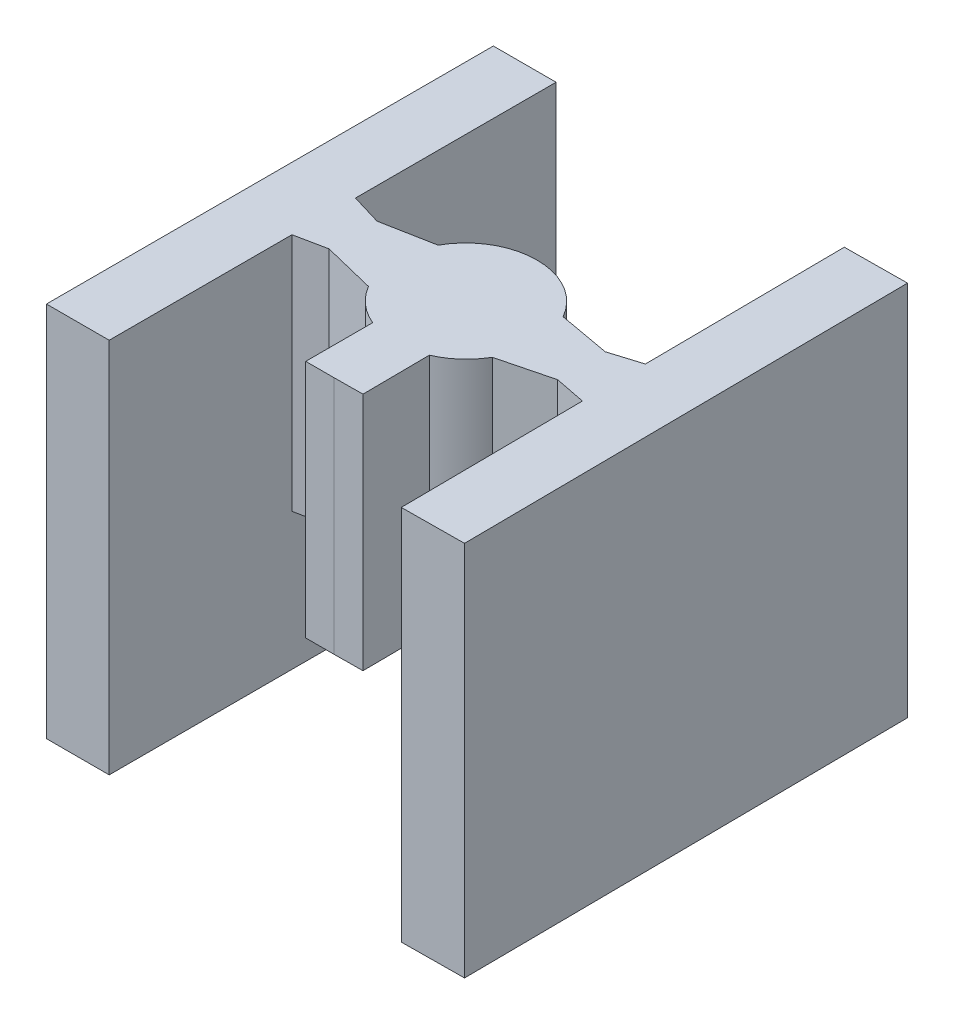
ISO-10303-21;
HEADER;
FILE_DESCRIPTION(('STEP AP214'),'2;1');
FILE_NAME('part.step','',(''),(''),'','','');
FILE_SCHEMA(('AUTOMOTIVE_DESIGN { 1 0 10303 214 1 1 1 1 }'));
ENDSEC;
DATA;
#1=APPLICATION_CONTEXT('core data for automotive mechanical design processes');
#2=APPLICATION_PROTOCOL_DEFINITION('international standard','automotive_design',2000,#1);
#3=PRODUCT_CONTEXT('',#1,'mechanical');
#4=PRODUCT('Part','Part','',(#3));
#5=PRODUCT_RELATED_PRODUCT_CATEGORY('part','',(#4));
#6=PRODUCT_DEFINITION_FORMATION('','',#4);
#7=PRODUCT_DEFINITION_CONTEXT('part definition',#1,'design');
#8=PRODUCT_DEFINITION('design','',#6,#7);
#9=PRODUCT_DEFINITION_SHAPE('','',#8);
#10=(LENGTH_UNIT() NAMED_UNIT(*) SI_UNIT(.MILLI.,.METRE.));
#11=(NAMED_UNIT(*) PLANE_ANGLE_UNIT() SI_UNIT($,.RADIAN.));
#12=(NAMED_UNIT(*) SI_UNIT($,.STERADIAN.) SOLID_ANGLE_UNIT());
#13=UNCERTAINTY_MEASURE_WITH_UNIT(LENGTH_MEASURE(1.E-05),#10,'distance_accuracy_value','');
#14=(GEOMETRIC_REPRESENTATION_CONTEXT(3) GLOBAL_UNCERTAINTY_ASSIGNED_CONTEXT((#13)) GLOBAL_UNIT_ASSIGNED_CONTEXT((#10,
#11,#12)) REPRESENTATION_CONTEXT('',''));
#15=CARTESIAN_POINT('',(0.,0.,0.));
#16=DIRECTION('',(0.,0.,1.));
#17=DIRECTION('',(1.,0.,0.));
#18=AXIS2_PLACEMENT_3D('',#15,#16,#17);
#19=CARTESIAN_POINT('',(30.4201519427729,0.,-37.7047103668261));
#20=DIRECTION('',(0.,1.,0.));
#21=DIRECTION('',(0.,0.,1.));
#22=AXIS2_PLACEMENT_3D('',#19,#20,#21);
#23=PLANE('',#22);
#24=DIRECTION('',(0.999962808426345,0.,-0.00862448630909776));
#25=VECTOR('',#24,1.);
#26=CARTESIAN_POINT('',(43.2743821323213,0.,-19.203600276804));
#27=LINE('',#26,#25);
#28=CARTESIAN_POINT('',(43.2743821323213,0.,-19.203600276804));
#29=VERTEX_POINT('',#28);
#30=CARTESIAN_POINT('',(48.7741775786662,0.,-19.251034951504));
#31=VERTEX_POINT('',#30);
#32=EDGE_CURVE('E309',#29,#31,#27,.T.);
#33=ORIENTED_EDGE('',*,*,#32,.F.);
#34=DIRECTION('',(0.00862448630909662,0.,0.999962808426346));
#35=VECTOR('',#34,1.);
#36=CARTESIAN_POINT('',(42.9365132233006,0.,-58.3776833509426));
#37=LINE('',#36,#35);
#38=CARTESIAN_POINT('',(42.9365132233006,0.,-58.3776833509426));
#39=VERTEX_POINT('',#38);
#40=EDGE_CURVE('E303',#39,#29,#37,.T.);
#41=ORIENTED_EDGE('',*,*,#40,.F.);
#42=DIRECTION('',(-0.999962808426346,0.,0.00862448630909529));
#43=VECTOR('',#42,1.);
#44=CARTESIAN_POINT('',(48.4363086696455,0.,-58.4251180256426));
#45=LINE('',#44,#43);
#46=CARTESIAN_POINT('',(48.4363086696455,0.,-58.4251180256426));
#47=VERTEX_POINT('',#46);
#48=EDGE_CURVE('E305',#47,#39,#45,.T.);
#49=ORIENTED_EDGE('',*,*,#48,.F.);
#50=DIRECTION('',(-0.008624486309097,0.,-0.999962808426346));
#51=VECTOR('',#50,1.);
#52=CARTESIAN_POINT('',(48.7741775786662,0.,-19.251034951504));
#53=LINE('',#52,#51);
#54=EDGE_CURVE('E307',#31,#47,#53,.T.);
#55=ORIENTED_EDGE('',*,*,#54,.F.);
#56=EDGE_LOOP('',(#33,#41,#49,#55));
#57=FACE_BOUND('',#56,.T.);
#58=ADVANCED_FACE('F33',(#57),#23,.F.);
#59=DIRECTION('',(-1.,0.,0.));
#60=VECTOR('',#59,1.);
#61=CARTESIAN_POINT('',(12.2796476849857,0.,-58.2691988123798));
#62=LINE('',#61,#60);
#63=CARTESIAN_POINT('',(17.7796476849856,0.,-58.2691988123798));
#64=VERTEX_POINT('',#63);
#65=CARTESIAN_POINT('',(12.2796476849857,0.,-58.2691988123798));
#66=VERTEX_POINT('',#65);
#67=EDGE_CURVE('E301',#64,#66,#62,.T.);
#68=ORIENTED_EDGE('',*,*,#67,.F.);
#69=DIRECTION('',(0.,0.,-1.));
#70=VECTOR('',#69,1.);
#71=CARTESIAN_POINT('',(17.7796476849856,0.,-35.1144431425172));
#72=LINE('',#71,#70);
#73=CARTESIAN_POINT('',(17.7796476849856,0.,-19.093658738257));
#74=VERTEX_POINT('',#73);
#75=EDGE_CURVE('E294',#74,#64,#72,.T.);
#76=ORIENTED_EDGE('',*,*,#75,.F.);
#77=DIRECTION('',(1.,0.,0.));
#78=VECTOR('',#77,1.);
#79=CARTESIAN_POINT('',(17.7796476849856,0.,-19.093658738257));
#80=LINE('',#79,#78);
#81=CARTESIAN_POINT('',(12.2796476849856,0.,-19.093658738257));
#82=VERTEX_POINT('',#81);
#83=EDGE_CURVE('E297',#82,#74,#80,.T.);
#84=ORIENTED_EDGE('',*,*,#83,.F.);
#85=DIRECTION('',(0.,0.,1.));
#86=VECTOR('',#85,1.);
#87=CARTESIAN_POINT('',(12.2796476849856,0.,-19.093658738257));
#88=LINE('',#87,#86);
#89=EDGE_CURVE('E299',#66,#82,#88,.T.);
#90=ORIENTED_EDGE('',*,*,#89,.F.);
#91=EDGE_LOOP('',(#68,#76,#84,#90));
#92=FACE_BOUND('',#91,.T.);
#93=ADVANCED_FACE('F485',(#92),#23,.F.);
#94=CARTESIAN_POINT('',(27.9970189702549,33.,-26.1043973727644));
#95=DIRECTION('',(1.,0.,0.));
#96=DIRECTION('',(0.,0.,-1.));
#97=AXIS2_PLACEMENT_3D('',#94,#95,#96);
#98=PLANE('',#97);
#99=DIRECTION('',(0.,-1.,0.));
#100=VECTOR('',#99,1.);
#101=CARTESIAN_POINT('',(27.9970189702549,33.,-31.9709533691748));
#102=LINE('',#101,#100);
#103=CARTESIAN_POINT('',(27.9970189702549,33.,-31.9709533691748));
#104=VERTEX_POINT('',#103);
#105=CARTESIAN_POINT('',(27.9970189702549,12.,-31.9709533691748));
#106=VERTEX_POINT('',#105);
#107=EDGE_CURVE('E290',#104,#106,#102,.T.);
#108=ORIENTED_EDGE('',*,*,#107,.T.);
#109=DIRECTION('',(0.,0.,1.));
#110=VECTOR('',#109,1.);
#111=CARTESIAN_POINT('',(27.9970189702549,12.,-31.9709533691748));
#112=LINE('',#111,#110);
#113=CARTESIAN_POINT('',(27.9970189702549,12.,-26.1043973727644));
#114=VERTEX_POINT('',#113);
#115=EDGE_CURVE('E366',#106,#114,#112,.T.);
#116=ORIENTED_EDGE('',*,*,#115,.T.);
#117=DIRECTION('',(0.,-1.,0.));
#118=VECTOR('',#117,1.);
#119=CARTESIAN_POINT('',(27.9970189702549,33.,-26.1043973727644));
#120=LINE('',#119,#118);
#121=CARTESIAN_POINT('',(27.9970189702549,33.,-26.1043973727644));
#122=VERTEX_POINT('',#121);
#123=EDGE_CURVE('E11',#122,#114,#120,.T.);
#124=ORIENTED_EDGE('',*,*,#123,.F.);
#125=DIRECTION('',(0.,0.,1.));
#126=VECTOR('',#125,1.);
#127=CARTESIAN_POINT('',(27.9970189702549,33.,-26.1043973727644));
#128=LINE('',#127,#126);
#129=EDGE_CURVE('E296',#104,#122,#128,.T.);
#130=ORIENTED_EDGE('',*,*,#129,.F.);
#131=EDGE_LOOP('',(#108,#116,#124,#130));
#132=FACE_BOUND('',#131,.T.);
#133=ADVANCED_FACE('F35',(#132),#98,.F.);
#134=CARTESIAN_POINT('',(27.9970189702549,33.,-26.1043973727644));
#135=DIRECTION('',(0.,0.,-1.));
#136=DIRECTION('',(-1.,0.,0.));
#137=AXIS2_PLACEMENT_3D('',#134,#135,#136);
#138=PLANE('',#137);
#139=ORIENTED_EDGE('',*,*,#123,.T.);
#140=DIRECTION('',(-1.,0.,0.));
#141=VECTOR('',#140,1.);
#142=CARTESIAN_POINT('',(27.9970189702549,12.,-26.1043973727643));
#143=LINE('',#142,#141);
#144=CARTESIAN_POINT('',(30.4970193884969,12.,-26.1043973727643));
#145=VERTEX_POINT('',#144);
#146=EDGE_CURVE('E48',#145,#114,#143,.T.);
#147=ORIENTED_EDGE('',*,*,#146,.F.);
#148=DIRECTION('',(0.,-1.,0.));
#149=VECTOR('',#148,1.);
#150=CARTESIAN_POINT('',(30.4970193885017,33.,-26.1043973727644));
#151=LINE('',#150,#149);
#152=CARTESIAN_POINT('',(30.4970193885017,33.,-26.1043973727644));
#153=VERTEX_POINT('',#152);
#154=EDGE_CURVE('E41',#153,#145,#151,.T.);
#155=ORIENTED_EDGE('',*,*,#154,.F.);
#156=DIRECTION('',(1.,0.,0.));
#157=VECTOR('',#156,1.);
#158=CARTESIAN_POINT('',(27.9970189702549,33.,-26.1043973727644));
#159=LINE('',#158,#157);
#160=EDGE_CURVE('E358',#122,#153,#159,.T.);
#161=ORIENTED_EDGE('',*,*,#160,.F.);
#162=EDGE_LOOP('',(#139,#147,#155,#161));
#163=FACE_BOUND('',#162,.T.);
#164=ADVANCED_FACE('F218',(#163),#138,.F.);
#165=CARTESIAN_POINT('',(32.9969268277988,33.,-26.1259585921443));
#166=DIRECTION('',(-0.00862448630909563,0.,-0.999962808426345));
#167=DIRECTION('',(-0.999962808426346,0.,0.00862448630909563));
#168=AXIS2_PLACEMENT_3D('',#165,#166,#167);
#169=PLANE('',#168);
#170=ORIENTED_EDGE('',*,*,#154,.T.);
#171=DIRECTION('',(0.999962808426346,0.,-0.00862448630909563));
#172=VECTOR('',#171,1.);
#173=CARTESIAN_POINT('',(32.9969268277988,12.,-26.1259585921443));
#174=LINE('',#173,#172);
#175=CARTESIAN_POINT('',(32.9969268277988,12.,-26.1259585921443));
#176=VERTEX_POINT('',#175);
#177=EDGE_CURVE('E206',#145,#176,#174,.T.);
#178=ORIENTED_EDGE('',*,*,#177,.T.);
#179=DIRECTION('',(0.,-1.,0.));
#180=VECTOR('',#179,1.);
#181=CARTESIAN_POINT('',(32.9969268277988,33.,-26.1259585921443));
#182=LINE('',#181,#180);
#183=CARTESIAN_POINT('',(32.9969268277988,33.,-26.1259585921443));
#184=VERTEX_POINT('',#183);
#185=EDGE_CURVE('E224',#184,#176,#182,.T.);
#186=ORIENTED_EDGE('',*,*,#185,.F.);
#187=DIRECTION('',(0.999962808426345,0.,-0.00862448630909563));
#188=VECTOR('',#187,1.);
#189=CARTESIAN_POINT('',(32.9969268277988,33.,-26.1259585921443));
#190=LINE('',#189,#188);
#191=EDGE_CURVE('E223',#153,#184,#190,.T.);
#192=ORIENTED_EDGE('',*,*,#191,.F.);
#193=EDGE_LOOP('',(#170,#178,#186,#192));
#194=FACE_BOUND('',#193,.T.);
#195=ADVANCED_FACE('F222',(#194),#169,.F.);
#196=CARTESIAN_POINT('',(32.9969268277988,33.,-26.1259585921443));
#197=DIRECTION('',(-0.999962808426345,0.,0.00862448630909741));
#198=DIRECTION('',(0.00862448630909741,0.,0.999962808426346));
#199=AXIS2_PLACEMENT_3D('',#196,#197,#198);
#200=PLANE('',#199);
#201=ORIENTED_EDGE('',*,*,#185,.T.);
#202=DIRECTION('',(-0.00862448630909741,0.,-0.999962808426346));
#203=VECTOR('',#202,1.);
#204=CARTESIAN_POINT('',(32.9969268277988,12.,-26.1259585921443));
#205=LINE('',#204,#203);
#206=CARTESIAN_POINT('',(32.9463307959262,12.,-31.9922964021052));
#207=VERTEX_POINT('',#206);
#208=EDGE_CURVE('E56',#176,#207,#205,.T.);
#209=ORIENTED_EDGE('',*,*,#208,.T.);
#210=DIRECTION('',(0.,-1.,0.));
#211=VECTOR('',#210,1.);
#212=CARTESIAN_POINT('',(32.9463307959262,33.,-31.9922964021052));
#213=LINE('',#212,#211);
#214=CARTESIAN_POINT('',(32.9463307959262,33.,-31.9922964021052));
#215=VERTEX_POINT('',#214);
#216=EDGE_CURVE('E225',#215,#207,#213,.T.);
#217=ORIENTED_EDGE('',*,*,#216,.F.);
#218=DIRECTION('',(-0.00862448630909741,0.,-0.999962808426346));
#219=VECTOR('',#218,1.);
#220=CARTESIAN_POINT('',(32.9969268277988,33.,-26.1259585921443));
#221=LINE('',#220,#219);
#222=EDGE_CURVE('E355',#184,#215,#221,.T.);
#223=ORIENTED_EDGE('',*,*,#222,.F.);
#224=EDGE_LOOP('',(#201,#209,#217,#223));
#225=FACE_BOUND('',#224,.T.);
#226=ADVANCED_FACE('F446',(#225),#200,.F.);
#227=CARTESIAN_POINT('',(30.4738372348107,33.,-37.7049418751643));
#228=DIRECTION('',(0.,-1.,0.));
#229=DIRECTION('',(0.,0.,-1.));
#230=AXIS2_PLACEMENT_3D('',#227,#228,#229);
#231=CYLINDRICAL_SURFACE('',#230,6.22475242163252);
#232=ORIENTED_EDGE('',*,*,#216,.T.);
#233=CARTESIAN_POINT('',(30.4738372348107,12.,-37.7049418751644));
#234=DIRECTION('',(0.,1.,0.));
#235=DIRECTION('',(0.,0.,1.));
#236=AXIS2_PLACEMENT_3D('',#233,#234,#235);
#237=CIRCLE('',#236,6.22475242163263);
#238=CARTESIAN_POINT('',(35.8638647298149,12.,-34.5912388845566));
#239=VERTEX_POINT('',#238);
#240=EDGE_CURVE('E369',#207,#239,#237,.T.);
#241=ORIENTED_EDGE('',*,*,#240,.T.);
#242=DIRECTION('',(0.,-1.,0.));
#243=VECTOR('',#242,1.);
#244=CARTESIAN_POINT('',(35.8638647298149,33.,-34.5912388845566));
#245=LINE('',#244,#243);
#246=CARTESIAN_POINT('',(35.8638647298149,33.,-34.5912388845566));
#247=VERTEX_POINT('',#246);
#248=EDGE_CURVE('E229',#247,#239,#245,.T.);
#249=ORIENTED_EDGE('',*,*,#248,.F.);
#250=CARTESIAN_POINT('',(30.4738372348107,33.,-37.7049418751643));
#251=DIRECTION('',(0.,1.,0.));
#252=DIRECTION('',(0.,0.,-1.));
#253=AXIS2_PLACEMENT_3D('',#250,#251,#252);
#254=CIRCLE('',#253,6.22475242163252);
#255=EDGE_CURVE('E353',#215,#247,#254,.T.);
#256=ORIENTED_EDGE('',*,*,#255,.F.);
#257=EDGE_LOOP('',(#232,#241,#249,#256));
#258=FACE_BOUND('',#257,.T.);
#259=ADVANCED_FACE('F444',(#258),#231,.T.);
#260=CARTESIAN_POINT('',(35.8638647298149,33.,-34.5912388845566));
#261=DIRECTION('',(-0.246647604540995,0.,-0.969105236377448));
#262=DIRECTION('',(-0.969105236377448,0.,0.246647604540995));
#263=AXIS2_PLACEMENT_3D('',#260,#261,#262);
#264=PLANE('',#263);
#265=ORIENTED_EDGE('',*,*,#248,.T.);
#266=DIRECTION('',(0.969105236377448,0.,-0.246647604540994));
#267=VECTOR('',#266,1.);
#268=CARTESIAN_POINT('',(35.8638647298149,12.,-34.5912388845566));
#269=LINE('',#268,#267);
#270=CARTESIAN_POINT('',(40.4315397694171,12.,-35.7537608321739));
#271=VERTEX_POINT('',#270);
#272=EDGE_CURVE('E371',#239,#271,#269,.T.);
#273=ORIENTED_EDGE('',*,*,#272,.T.);
#274=DIRECTION('',(0.,-1.,0.));
#275=VECTOR('',#274,1.);
#276=CARTESIAN_POINT('',(40.4315397694171,33.,-35.7537608321739));
#277=LINE('',#276,#275);
#278=CARTESIAN_POINT('',(40.4315397694171,33.,-35.7537608321739));
#279=VERTEX_POINT('',#278);
#280=EDGE_CURVE('E232',#279,#271,#277,.T.);
#281=ORIENTED_EDGE('',*,*,#280,.F.);
#282=DIRECTION('',(0.969105236377448,0.,-0.246647604540995));
#283=VECTOR('',#282,1.);
#284=CARTESIAN_POINT('',(35.8638647298149,33.,-34.5912388845566));
#285=LINE('',#284,#283);
#286=EDGE_CURVE('E351',#247,#279,#285,.T.);
#287=ORIENTED_EDGE('',*,*,#286,.F.);
#288=EDGE_LOOP('',(#265,#273,#281,#287));
#289=FACE_BOUND('',#288,.T.);
#290=ADVANCED_FACE('F439',(#289),#264,.F.);
#291=CARTESIAN_POINT('',(40.4315397694171,33.,-35.7537608321739));
#292=DIRECTION('',(0.192290170789592,0.,-0.981338112078457));
#293=DIRECTION('',(-0.981338112078457,0.,-0.192290170789592));
#294=AXIS2_PLACEMENT_3D('',#291,#292,#293);
#295=PLANE('',#294);
#296=ORIENTED_EDGE('',*,*,#280,.T.);
#297=DIRECTION('',(0.981338112078457,0.,0.192290170789592));
#298=VECTOR('',#297,1.);
#299=CARTESIAN_POINT('',(40.4315397694171,12.,-35.7537608321739));
#300=LINE('',#299,#298);
#301=CARTESIAN_POINT('',(43.1362110965658,12.,-35.223788842881));
#302=VERTEX_POINT('',#301);
#303=EDGE_CURVE('E373',#271,#302,#300,.T.);
#304=ORIENTED_EDGE('',*,*,#303,.T.);
#305=DIRECTION('',(0.,-1.,0.));
#306=VECTOR('',#305,1.);
#307=CARTESIAN_POINT('',(43.1362110965658,33.,-35.223788842881));
#308=LINE('',#307,#306);
#309=CARTESIAN_POINT('',(43.1362110965658,33.,-35.223788842881));
#310=VERTEX_POINT('',#309);
#311=EDGE_CURVE('E235',#310,#302,#308,.T.);
#312=ORIENTED_EDGE('',*,*,#311,.F.);
#313=DIRECTION('',(0.981338112078457,0.,0.192290170789592));
#314=VECTOR('',#313,1.);
#315=CARTESIAN_POINT('',(40.4315397694171,33.,-35.7537608321739));
#316=LINE('',#315,#314);
#317=EDGE_CURVE('E349',#279,#310,#316,.T.);
#318=ORIENTED_EDGE('',*,*,#317,.F.);
#319=EDGE_LOOP('',(#296,#304,#312,#318));
#320=FACE_BOUND('',#319,.T.);
#321=ADVANCED_FACE('F435',(#320),#295,.F.);
#322=CARTESIAN_POINT('',(43.2743821323213,33.,-19.203600276804));
#323=DIRECTION('',(-0.00862448630909776,0.,-0.999962808426345));
#324=DIRECTION('',(-0.999962808426346,0.,0.00862448630909776));
#325=AXIS2_PLACEMENT_3D('',#322,#323,#324);
#326=PLANE('',#325);
#327=ORIENTED_EDGE('',*,*,#32,.T.);
#328=DIRECTION('',(0.,-1.,0.));
#329=VECTOR('',#328,1.);
#330=CARTESIAN_POINT('',(48.7741775786662,33.,-19.251034951504));
#331=LINE('',#330,#329);
#332=CARTESIAN_POINT('',(48.7741775786662,33.,-19.251034951504));
#333=VERTEX_POINT('',#332);
#334=EDGE_CURVE('E241',#333,#31,#331,.T.);
#335=ORIENTED_EDGE('',*,*,#334,.F.);
#336=DIRECTION('',(0.999962808426345,0.,-0.00862448630909776));
#337=VECTOR('',#336,1.);
#338=CARTESIAN_POINT('',(43.2743821323213,33.,-19.203600276804));
#339=LINE('',#338,#337);
#340=CARTESIAN_POINT('',(43.2743821323213,33.,-19.203600276804));
#341=VERTEX_POINT('',#340);
#342=EDGE_CURVE('E345',#341,#333,#339,.T.);
#343=ORIENTED_EDGE('',*,*,#342,.F.);
#344=DIRECTION('',(0.,-1.,0.));
#345=VECTOR('',#344,1.);
#346=CARTESIAN_POINT('',(43.2743821323213,33.,-19.203600276804));
#347=LINE('',#346,#345);
#348=EDGE_CURVE('E238',#341,#29,#347,.T.);
#349=ORIENTED_EDGE('',*,*,#348,.T.);
#350=EDGE_LOOP('',(#327,#335,#343,#349));
#351=FACE_BOUND('',#350,.T.);
#352=ADVANCED_FACE('F532',(#351),#326,.F.);
#353=CARTESIAN_POINT('',(48.7741775786662,33.,-19.251034951504));
#354=DIRECTION('',(-0.999962808426345,0.,0.008624486309097));
#355=DIRECTION('',(0.008624486309097,0.,0.999962808426346));
#356=AXIS2_PLACEMENT_3D('',#353,#354,#355);
#357=PLANE('',#356);
#358=ORIENTED_EDGE('',*,*,#54,.T.);
#359=DIRECTION('',(0.,-1.,0.));
#360=VECTOR('',#359,1.);
#361=CARTESIAN_POINT('',(48.4363086696455,33.,-58.4251180256426));
#362=LINE('',#361,#360);
#363=CARTESIAN_POINT('',(48.4363086696455,33.,-58.4251180256426));
#364=VERTEX_POINT('',#363);
#365=EDGE_CURVE('E244',#364,#47,#362,.T.);
#366=ORIENTED_EDGE('',*,*,#365,.F.);
#367=DIRECTION('',(-0.008624486309097,0.,-0.999962808426346));
#368=VECTOR('',#367,1.);
#369=CARTESIAN_POINT('',(48.7741775786662,33.,-19.251034951504));
#370=LINE('',#369,#368);
#371=EDGE_CURVE('E343',#333,#364,#370,.T.);
#372=ORIENTED_EDGE('',*,*,#371,.F.);
#373=ORIENTED_EDGE('',*,*,#334,.T.);
#374=EDGE_LOOP('',(#358,#366,#372,#373));
#375=FACE_BOUND('',#374,.T.);
#376=ADVANCED_FACE('F528',(#375),#357,.F.);
#377=CARTESIAN_POINT('',(48.4363086696455,33.,-58.4251180256426));
#378=DIRECTION('',(0.00862448630909529,0.,0.999962808426345));
#379=DIRECTION('',(0.999962808426346,0.,-0.00862448630909529));
#380=AXIS2_PLACEMENT_3D('',#377,#378,#379);
#381=PLANE('',#380);
#382=ORIENTED_EDGE('',*,*,#48,.T.);
#383=DIRECTION('',(0.,-1.,0.));
#384=VECTOR('',#383,1.);
#385=CARTESIAN_POINT('',(42.9365132233006,33.,-58.3776833509426));
#386=LINE('',#385,#384);
#387=CARTESIAN_POINT('',(42.9365132233006,33.,-58.3776833509426));
#388=VERTEX_POINT('',#387);
#389=EDGE_CURVE('E247',#388,#39,#386,.T.);
#390=ORIENTED_EDGE('',*,*,#389,.F.);
#391=DIRECTION('',(-0.999962808426346,0.,0.00862448630909529));
#392=VECTOR('',#391,1.);
#393=CARTESIAN_POINT('',(48.4363086696455,33.,-58.4251180256426));
#394=LINE('',#393,#392);
#395=EDGE_CURVE('E341',#364,#388,#394,.T.);
#396=ORIENTED_EDGE('',*,*,#395,.F.);
#397=ORIENTED_EDGE('',*,*,#365,.T.);
#398=EDGE_LOOP('',(#382,#390,#396,#397));
#399=FACE_BOUND('',#398,.T.);
#400=ADVANCED_FACE('F525',(#399),#381,.F.);
#401=CARTESIAN_POINT('',(42.9365132233006,33.,-58.3776833509426));
#402=DIRECTION('',(0.999962808426345,0.,-0.00862448630909662));
#403=DIRECTION('',(-0.00862448630909662,0.,-0.999962808426346));
#404=AXIS2_PLACEMENT_3D('',#401,#402,#403);
#405=PLANE('',#404);
#406=ORIENTED_EDGE('',*,*,#40,.T.);
#407=ORIENTED_EDGE('',*,*,#348,.F.);
#408=DIRECTION('',(0.00862448630909483,0.,0.999962808426345));
#409=VECTOR('',#408,1.);
#410=CARTESIAN_POINT('',(43.1362110965658,33.,-35.223788842881));
#411=LINE('',#410,#409);
#412=EDGE_CURVE('E347',#310,#341,#411,.T.);
#413=ORIENTED_EDGE('',*,*,#412,.F.);
#414=ORIENTED_EDGE('',*,*,#311,.T.);
#415=DIRECTION('',(-0.0086244863090982,0.,-0.999962808426346));
#416=VECTOR('',#415,1.);
#417=CARTESIAN_POINT('',(43.1362110965658,12.,-35.223788842881));
#418=LINE('',#417,#416);
#419=CARTESIAN_POINT('',(43.0881960389902,12.,-40.7908765625737));
#420=VERTEX_POINT('',#419);
#421=EDGE_CURVE('E375',#302,#420,#418,.T.);
#422=ORIENTED_EDGE('',*,*,#421,.T.);
#423=DIRECTION('',(0.,-1.,0.));
#424=VECTOR('',#423,1.);
#425=CARTESIAN_POINT('',(43.0881960389902,33.,-40.7908765625737));
#426=LINE('',#425,#424);
#427=CARTESIAN_POINT('',(43.0881960389902,33.,-40.7908765625737));
#428=VERTEX_POINT('',#427);
#429=EDGE_CURVE('E250',#428,#420,#426,.T.);
#430=ORIENTED_EDGE('',*,*,#429,.F.);
#431=DIRECTION('',(0.00862448630909662,0.,0.999962808426346));
#432=VECTOR('',#431,1.);
#433=CARTESIAN_POINT('',(42.9365132233006,33.,-58.3776833509426));
#434=LINE('',#433,#432);
#435=EDGE_CURVE('E339',#388,#428,#434,.T.);
#436=ORIENTED_EDGE('',*,*,#435,.F.);
#437=ORIENTED_EDGE('',*,*,#389,.T.);
#438=EDGE_LOOP('',(#406,#407,#413,#414,#422,#430,#436,#437));
#439=FACE_BOUND('',#438,.T.);
#440=ADVANCED_FACE('F428',(#439),#405,.F.);
#441=CARTESIAN_POINT('',(43.0881960389902,33.,-40.7908765625737));
#442=DIRECTION('',(0.295076846057064,0.,0.955473523924664));
#443=DIRECTION('',(0.955473523924664,0.,-0.295076846057064));
#444=AXIS2_PLACEMENT_3D('',#441,#442,#443);
#445=PLANE('',#444);
#446=ORIENTED_EDGE('',*,*,#429,.T.);
#447=DIRECTION('',(-0.955473523924664,0.,0.295076846057064));
#448=VECTOR('',#447,1.);
#449=CARTESIAN_POINT('',(43.0881960389902,12.,-40.7908765625737));
#450=LINE('',#449,#448);
#451=CARTESIAN_POINT('',(40.3952684480576,12.,-39.9592254908323));
#452=VERTEX_POINT('',#451);
#453=EDGE_CURVE('E378',#420,#452,#450,.T.);
#454=ORIENTED_EDGE('',*,*,#453,.T.);
#455=DIRECTION('',(0.,-1.,0.));
#456=VECTOR('',#455,1.);
#457=CARTESIAN_POINT('',(40.3952684480576,33.,-39.9592254908323));
#458=LINE('',#457,#456);
#459=CARTESIAN_POINT('',(40.3952684480576,33.,-39.9592254908323));
#460=VERTEX_POINT('',#459);
#461=EDGE_CURVE('E252',#460,#452,#458,.T.);
#462=ORIENTED_EDGE('',*,*,#461,.F.);
#463=DIRECTION('',(-0.955473523924664,0.,0.295076846057064));
#464=VECTOR('',#463,1.);
#465=CARTESIAN_POINT('',(43.0881960389902,33.,-40.7908765625737));
#466=LINE('',#465,#464);
#467=EDGE_CURVE('E337',#428,#460,#466,.T.);
#468=ORIENTED_EDGE('',*,*,#467,.F.);
#469=EDGE_LOOP('',(#446,#454,#462,#468));
#470=FACE_BOUND('',#469,.T.);
#471=ADVANCED_FACE('F520',(#470),#445,.F.);
#472=CARTESIAN_POINT('',(35.8886314142691,33.,-40.7753729043073));
#473=DIRECTION('',(-0.178200359676966,0.,0.983994223464244));
#474=DIRECTION('',(0.983994223464244,0.,0.178200359676966));
#475=AXIS2_PLACEMENT_3D('',#472,#473,#474);
#476=PLANE('',#475);
#477=ORIENTED_EDGE('',*,*,#461,.T.);
#478=DIRECTION('',(-0.983994223464244,0.,-0.178200359676966));
#479=VECTOR('',#478,1.);
#480=CARTESIAN_POINT('',(40.3952684480576,12.,-39.9592254908323));
#481=LINE('',#480,#479);
#482=CARTESIAN_POINT('',(35.8886314142691,12.,-40.7753729043073));
#483=VERTEX_POINT('',#482);
#484=EDGE_CURVE('E380',#452,#483,#481,.T.);
#485=ORIENTED_EDGE('',*,*,#484,.T.);
#486=DIRECTION('',(0.,-1.,0.));
#487=VECTOR('',#486,1.);
#488=CARTESIAN_POINT('',(35.8886314142691,33.,-40.7753729043073));
#489=LINE('',#488,#487);
#490=CARTESIAN_POINT('',(35.8886314142691,33.,-40.7753729043073));
#491=VERTEX_POINT('',#490);
#492=EDGE_CURVE('E255',#491,#483,#489,.T.);
#493=ORIENTED_EDGE('',*,*,#492,.F.);
#494=DIRECTION('',(-0.983994223464244,0.,-0.178200359676966));
#495=VECTOR('',#494,1.);
#496=CARTESIAN_POINT('',(35.8886314142691,33.,-40.7753729043073));
#497=LINE('',#496,#495);
#498=EDGE_CURVE('E335',#460,#491,#497,.T.);
#499=ORIENTED_EDGE('',*,*,#498,.F.);
#500=EDGE_LOOP('',(#477,#485,#493,#499));
#501=FACE_BOUND('',#500,.T.);
#502=ADVANCED_FACE('F422',(#501),#476,.F.);
#503=CARTESIAN_POINT('',(30.4738372348107,33.,-37.7049418751643));
#504=DIRECTION('',(0.,-1.,0.));
#505=DIRECTION('',(0.,0.,-1.));
#506=AXIS2_PLACEMENT_3D('',#503,#504,#505);
#507=CYLINDRICAL_SURFACE('',#506,6.22475242163252);
#508=ORIENTED_EDGE('',*,*,#492,.T.);
#509=CARTESIAN_POINT('',(30.4738372348107,12.,-37.7049418751643));
#510=DIRECTION('',(0.,1.,0.));
#511=DIRECTION('',(0.,0.,1.));
#512=AXIS2_PLACEMENT_3D('',#509,#510,#511);
#513=CIRCLE('',#512,6.22475242163252);
#514=CARTESIAN_POINT('',(30.4201519427729,12.,-43.9294627884587));
#515=VERTEX_POINT('',#514);
#516=EDGE_CURVE('E214',#483,#515,#513,.T.);
#517=ORIENTED_EDGE('',*,*,#516,.T.);
#518=DIRECTION('',(0.,-1.,0.));
#519=VECTOR('',#518,1.);
#520=CARTESIAN_POINT('',(30.4201519427729,33.,-43.9294627884587));
#521=LINE('',#520,#519);
#522=CARTESIAN_POINT('',(30.4201519427729,33.,-43.9294627884587));
#523=VERTEX_POINT('',#522);
#524=EDGE_CURVE('E258',#523,#515,#521,.T.);
#525=ORIENTED_EDGE('',*,*,#524,.F.);
#526=CARTESIAN_POINT('',(30.4738372348107,33.,-37.7049418751643));
#527=DIRECTION('',(0.,1.,0.));
#528=DIRECTION('',(0.,0.,-1.));
#529=AXIS2_PLACEMENT_3D('',#526,#527,#528);
#530=CIRCLE('',#529,6.22475242163252);
#531=EDGE_CURVE('E333',#491,#523,#530,.T.);
#532=ORIENTED_EDGE('',*,*,#531,.F.);
#533=EDGE_LOOP('',(#508,#517,#525,#532));
#534=FACE_BOUND('',#533,.T.);
#535=ADVANCED_FACE('F394',(#534),#507,.T.);
#536=CARTESIAN_POINT('',(30.4201519427729,33.,-37.7047103668261));
#537=DIRECTION('',(0.,-1.,0.));
#538=DIRECTION('',(0.,0.,-1.));
#539=AXIS2_PLACEMENT_3D('',#536,#537,#538);
#540=CYLINDRICAL_SURFACE('',#539,6.22475242163251);
#541=ORIENTED_EDGE('',*,*,#524,.T.);
#542=CARTESIAN_POINT('',(30.4201519427729,12.,-37.7047103668261));
#543=DIRECTION('',(0.,1.,0.));
#544=DIRECTION('',(0.,0.,1.));
#545=AXIS2_PLACEMENT_3D('',#542,#543,#544);
#546=CIRCLE('',#545,6.22475242163256);
#547=CARTESIAN_POINT('',(24.9790782576572,12.,-40.72832738354));
#548=VERTEX_POINT('',#547);
#549=EDGE_CURVE('E382',#515,#548,#546,.T.);
#550=ORIENTED_EDGE('',*,*,#549,.T.);
#551=DIRECTION('',(0.,-1.,0.));
#552=VECTOR('',#551,1.);
#553=CARTESIAN_POINT('',(24.9790782576572,33.,-40.72832738354));
#554=LINE('',#553,#552);
#555=CARTESIAN_POINT('',(24.9790782576572,33.,-40.72832738354));
#556=VERTEX_POINT('',#555);
#557=EDGE_CURVE('E261',#556,#548,#554,.T.);
#558=ORIENTED_EDGE('',*,*,#557,.F.);
#559=CARTESIAN_POINT('',(30.4201519427729,33.,-37.7047103668261));
#560=DIRECTION('',(0.,1.,0.));
#561=DIRECTION('',(0.,0.,1.));
#562=AXIS2_PLACEMENT_3D('',#559,#560,#561);
#563=CIRCLE('',#562,6.22475242163251);
#564=EDGE_CURVE('E331',#523,#556,#563,.T.);
#565=ORIENTED_EDGE('',*,*,#564,.F.);
#566=EDGE_LOOP('',(#541,#550,#558,#565));
#567=FACE_BOUND('',#566,.T.);
#568=ADVANCED_FACE('F401',(#567),#540,.T.);
#569=CARTESIAN_POINT('',(24.9790782576572,33.,-40.72832738354));
#570=DIRECTION('',(0.186680176833693,0.,0.98242074060829));
#571=DIRECTION('',(0.98242074060829,0.,-0.186680176833693));
#572=AXIS2_PLACEMENT_3D('',#569,#570,#571);
#573=PLANE('',#572);
#574=ORIENTED_EDGE('',*,*,#557,.T.);
#575=DIRECTION('',(-0.98242074060829,0.,0.186680176833693));
#576=VECTOR('',#575,1.);
#577=CARTESIAN_POINT('',(20.4796476849856,12.,-39.8733428944736));
#578=LINE('',#577,#576);
#579=CARTESIAN_POINT('',(20.4796476849856,12.,-39.8733428944736));
#580=VERTEX_POINT('',#579);
#581=EDGE_CURVE('E384',#548,#580,#578,.T.);
#582=ORIENTED_EDGE('',*,*,#581,.T.);
#583=DIRECTION('',(0.,-1.,0.));
#584=VECTOR('',#583,1.);
#585=CARTESIAN_POINT('',(20.4796476849856,33.,-39.8733428944736));
#586=LINE('',#585,#584);
#587=CARTESIAN_POINT('',(20.4796476849856,33.,-39.8733428944736));
#588=VERTEX_POINT('',#587);
#589=EDGE_CURVE('E264',#588,#580,#586,.T.);
#590=ORIENTED_EDGE('',*,*,#589,.F.);
#591=DIRECTION('',(-0.98242074060829,0.,0.186680176833693));
#592=VECTOR('',#591,1.);
#593=CARTESIAN_POINT('',(24.9790782576572,33.,-40.72832738354));
#594=LINE('',#593,#592);
#595=EDGE_CURVE('E329',#556,#588,#594,.T.);
#596=ORIENTED_EDGE('',*,*,#595,.F.);
#597=EDGE_LOOP('',(#574,#582,#590,#596));
#598=FACE_BOUND('',#597,.T.);
#599=ADVANCED_FACE('F408',(#598),#573,.F.);
#600=CARTESIAN_POINT('',(17.7796476849856,33.,-40.6817379186636));
#601=DIRECTION('',(-0.286825403359055,0.,0.957982874579664));
#602=DIRECTION('',(0.957982874579664,0.,0.286825403359055));
#603=AXIS2_PLACEMENT_3D('',#600,#601,#602);
#604=PLANE('',#603);
#605=ORIENTED_EDGE('',*,*,#589,.T.);
#606=DIRECTION('',(-0.957982874579664,0.,-0.286825403359055));
#607=VECTOR('',#606,1.);
#608=CARTESIAN_POINT('',(17.7796476849856,12.,-40.6817379186636));
#609=LINE('',#608,#607);
#610=CARTESIAN_POINT('',(17.7796476849856,12.,-40.6817379186636));
#611=VERTEX_POINT('',#610);
#612=EDGE_CURVE('E386',#580,#611,#609,.T.);
#613=ORIENTED_EDGE('',*,*,#612,.T.);
#614=DIRECTION('',(0.,-1.,0.));
#615=VECTOR('',#614,1.);
#616=CARTESIAN_POINT('',(17.7796476849856,33.,-40.6817379186636));
#617=LINE('',#616,#615);
#618=CARTESIAN_POINT('',(17.7796476849856,33.,-40.6817379186636));
#619=VERTEX_POINT('',#618);
#620=EDGE_CURVE('E267',#619,#611,#617,.T.);
#621=ORIENTED_EDGE('',*,*,#620,.F.);
#622=DIRECTION('',(-0.957982874579664,0.,-0.286825403359055));
#623=VECTOR('',#622,1.);
#624=CARTESIAN_POINT('',(17.7796476849856,33.,-40.6817379186636));
#625=LINE('',#624,#623);
#626=EDGE_CURVE('E327',#588,#619,#625,.T.);
#627=ORIENTED_EDGE('',*,*,#626,.F.);
#628=EDGE_LOOP('',(#605,#613,#621,#627));
#629=FACE_BOUND('',#628,.T.);
#630=ADVANCED_FACE('F412',(#629),#604,.F.);
#631=CARTESIAN_POINT('',(12.2796476849857,33.,-58.2691988123798));
#632=DIRECTION('',(0.,0.,1.));
#633=DIRECTION('',(1.,0.,0.));
#634=AXIS2_PLACEMENT_3D('',#631,#632,#633);
#635=PLANE('',#634);
#636=ORIENTED_EDGE('',*,*,#67,.T.);
#637=DIRECTION('',(0.,-1.,0.));
#638=VECTOR('',#637,1.);
#639=CARTESIAN_POINT('',(12.2796476849857,33.,-58.2691988123798));
#640=LINE('',#639,#638);
#641=CARTESIAN_POINT('',(12.2796476849857,33.,-58.2691988123798));
#642=VERTEX_POINT('',#641);
#643=EDGE_CURVE('E273',#642,#66,#640,.T.);
#644=ORIENTED_EDGE('',*,*,#643,.F.);
#645=DIRECTION('',(-1.,0.,0.));
#646=VECTOR('',#645,1.);
#647=CARTESIAN_POINT('',(12.2796476849857,33.,-58.2691988123798));
#648=LINE('',#647,#646);
#649=CARTESIAN_POINT('',(17.7796476849856,33.,-58.2691988123798));
#650=VERTEX_POINT('',#649);
#651=EDGE_CURVE('E323',#650,#642,#648,.T.);
#652=ORIENTED_EDGE('',*,*,#651,.F.);
#653=DIRECTION('',(0.,-1.,0.));
#654=VECTOR('',#653,1.);
#655=CARTESIAN_POINT('',(17.7796476849856,33.,-58.2691988123798));
#656=LINE('',#655,#654);
#657=EDGE_CURVE('E270',#650,#64,#656,.T.);
#658=ORIENTED_EDGE('',*,*,#657,.T.);
#659=EDGE_LOOP('',(#636,#644,#652,#658));
#660=FACE_BOUND('',#659,.T.);
#661=ADVANCED_FACE('F473',(#660),#635,.F.);
#662=CARTESIAN_POINT('',(12.2796476849856,33.,-19.093658738257));
#663=DIRECTION('',(1.,0.,0.));
#664=DIRECTION('',(0.,0.,-1.));
#665=AXIS2_PLACEMENT_3D('',#662,#663,#664);
#666=PLANE('',#665);
#667=ORIENTED_EDGE('',*,*,#89,.T.);
#668=DIRECTION('',(0.,-1.,0.));
#669=VECTOR('',#668,1.);
#670=CARTESIAN_POINT('',(12.2796476849856,33.,-19.093658738257));
#671=LINE('',#670,#669);
#672=CARTESIAN_POINT('',(12.2796476849856,33.,-19.093658738257));
#673=VERTEX_POINT('',#672);
#674=EDGE_CURVE('E276',#673,#82,#671,.T.);
#675=ORIENTED_EDGE('',*,*,#674,.F.);
#676=DIRECTION('',(0.,0.,1.));
#677=VECTOR('',#676,1.);
#678=CARTESIAN_POINT('',(12.2796476849856,33.,-19.093658738257));
#679=LINE('',#678,#677);
#680=EDGE_CURVE('E321',#642,#673,#679,.T.);
#681=ORIENTED_EDGE('',*,*,#680,.F.);
#682=ORIENTED_EDGE('',*,*,#643,.T.);
#683=EDGE_LOOP('',(#667,#675,#681,#682));
#684=FACE_BOUND('',#683,.T.);
#685=ADVANCED_FACE('F479',(#684),#666,.F.);
#686=CARTESIAN_POINT('',(17.7796476849856,33.,-19.093658738257));
#687=DIRECTION('',(0.,0.,-1.));
#688=DIRECTION('',(-1.,0.,0.));
#689=AXIS2_PLACEMENT_3D('',#686,#687,#688);
#690=PLANE('',#689);
#691=ORIENTED_EDGE('',*,*,#83,.T.);
#692=DIRECTION('',(0.,-1.,0.));
#693=VECTOR('',#692,1.);
#694=CARTESIAN_POINT('',(17.7796476849856,33.,-19.093658738257));
#695=LINE('',#694,#693);
#696=CARTESIAN_POINT('',(17.7796476849856,33.,-19.093658738257));
#697=VERTEX_POINT('',#696);
#698=EDGE_CURVE('E279',#697,#74,#695,.T.);
#699=ORIENTED_EDGE('',*,*,#698,.F.);
#700=DIRECTION('',(1.,0.,0.));
#701=VECTOR('',#700,1.);
#702=CARTESIAN_POINT('',(17.7796476849856,33.,-19.093658738257));
#703=LINE('',#702,#701);
#704=EDGE_CURVE('E319',#673,#697,#703,.T.);
#705=ORIENTED_EDGE('',*,*,#704,.F.);
#706=ORIENTED_EDGE('',*,*,#674,.T.);
#707=EDGE_LOOP('',(#691,#699,#705,#706));
#708=FACE_BOUND('',#707,.T.);
#709=ADVANCED_FACE('F483',(#708),#690,.F.);
#710=CARTESIAN_POINT('',(17.7796476849856,33.,-35.1144431425172));
#711=DIRECTION('',(-1.,0.,0.));
#712=DIRECTION('',(0.,0.,1.));
#713=AXIS2_PLACEMENT_3D('',#710,#711,#712);
#714=PLANE('',#713);
#715=ORIENTED_EDGE('',*,*,#75,.T.);
#716=ORIENTED_EDGE('',*,*,#657,.F.);
#717=DIRECTION('',(0.,0.,-1.));
#718=VECTOR('',#717,1.);
#719=CARTESIAN_POINT('',(17.7796476849856,33.,-58.2691988123798));
#720=LINE('',#719,#718);
#721=EDGE_CURVE('E325',#619,#650,#720,.T.);
#722=ORIENTED_EDGE('',*,*,#721,.F.);
#723=ORIENTED_EDGE('',*,*,#620,.T.);
#724=DIRECTION('',(0.,0.,1.));
#725=VECTOR('',#724,1.);
#726=CARTESIAN_POINT('',(17.7796476849856,12.,-35.1144431425172));
#727=LINE('',#726,#725);
#728=CARTESIAN_POINT('',(17.7796476849856,12.,-35.1144431425172));
#729=VERTEX_POINT('',#728);
#730=EDGE_CURVE('E363',#611,#729,#727,.T.);
#731=ORIENTED_EDGE('',*,*,#730,.T.);
#732=DIRECTION('',(0.,-1.,0.));
#733=VECTOR('',#732,1.);
#734=CARTESIAN_POINT('',(17.7796476849856,33.,-35.1144431425172));
#735=LINE('',#734,#733);
#736=CARTESIAN_POINT('',(17.7796476849856,33.,-35.1144431425172));
#737=VERTEX_POINT('',#736);
#738=EDGE_CURVE('E282',#737,#729,#735,.T.);
#739=ORIENTED_EDGE('',*,*,#738,.F.);
#740=DIRECTION('',(0.,0.,-1.));
#741=VECTOR('',#740,1.);
#742=CARTESIAN_POINT('',(17.7796476849856,33.,-35.1144431425172));
#743=LINE('',#742,#741);
#744=EDGE_CURVE('E317',#697,#737,#743,.T.);
#745=ORIENTED_EDGE('',*,*,#744,.F.);
#746=ORIENTED_EDGE('',*,*,#698,.T.);
#747=EDGE_LOOP('',(#715,#716,#722,#723,#731,#739,#745,#746));
#748=FACE_BOUND('',#747,.T.);
#749=ADVANCED_FACE('F466',(#748),#714,.F.);
#750=CARTESIAN_POINT('',(20.4796476849856,33.,-35.6677218221494));
#751=DIRECTION('',(-0.200746556327764,0.,-0.979643210624431));
#752=DIRECTION('',(-0.979643210624431,0.,0.200746556327765));
#753=AXIS2_PLACEMENT_3D('',#750,#751,#752);
#754=PLANE('',#753);
#755=ORIENTED_EDGE('',*,*,#738,.T.);
#756=DIRECTION('',(0.979643210624431,0.,-0.200746556327765));
#757=VECTOR('',#756,1.);
#758=CARTESIAN_POINT('',(20.4796476849856,12.,-35.6677218221494));
#759=LINE('',#758,#757);
#760=CARTESIAN_POINT('',(20.4796476849856,12.,-35.6677218221494));
#761=VERTEX_POINT('',#760);
#762=EDGE_CURVE('E213',#729,#761,#759,.T.);
#763=ORIENTED_EDGE('',*,*,#762,.T.);
#764=DIRECTION('',(0.,-1.,0.));
#765=VECTOR('',#764,1.);
#766=CARTESIAN_POINT('',(20.4796476849856,33.,-35.6677218221494));
#767=LINE('',#766,#765);
#768=CARTESIAN_POINT('',(20.4796476849856,33.,-35.6677218221494));
#769=VERTEX_POINT('',#768);
#770=EDGE_CURVE('E284',#769,#761,#767,.T.);
#771=ORIENTED_EDGE('',*,*,#770,.F.);
#772=DIRECTION('',(0.979643210624431,0.,-0.200746556327765));
#773=VECTOR('',#772,1.);
#774=CARTESIAN_POINT('',(20.4796476849856,33.,-35.6677218221494));
#775=LINE('',#774,#773);
#776=EDGE_CURVE('E315',#737,#769,#775,.T.);
#777=ORIENTED_EDGE('',*,*,#776,.F.);
#778=EDGE_LOOP('',(#755,#763,#771,#777));
#779=FACE_BOUND('',#778,.T.);
#780=ADVANCED_FACE('F463',(#779),#754,.F.);
#781=CARTESIAN_POINT('',(25.0571790001864,33.,-34.5446369613963));
#782=DIRECTION('',(0.238280396485232,0.,-0.971196402717206));
#783=DIRECTION('',(-0.971196402717206,0.,-0.238280396485232));
#784=AXIS2_PLACEMENT_3D('',#781,#782,#783);
#785=PLANE('',#784);
#786=ORIENTED_EDGE('',*,*,#770,.T.);
#787=DIRECTION('',(0.971196402717206,0.,0.238280396485232));
#788=VECTOR('',#787,1.);
#789=CARTESIAN_POINT('',(25.0571790001864,12.,-34.5446369613963));
#790=LINE('',#789,#788);
#791=CARTESIAN_POINT('',(25.0571790001864,12.,-34.5446369613963));
#792=VERTEX_POINT('',#791);
#793=EDGE_CURVE('E311',#761,#792,#790,.T.);
#794=ORIENTED_EDGE('',*,*,#793,.T.);
#795=DIRECTION('',(0.,-1.,0.));
#796=VECTOR('',#795,1.);
#797=CARTESIAN_POINT('',(25.0571790001864,33.,-34.5446369613963));
#798=LINE('',#797,#796);
#799=CARTESIAN_POINT('',(25.0571790001864,33.,-34.5446369613963));
#800=VERTEX_POINT('',#799);
#801=EDGE_CURVE('E287',#800,#792,#798,.T.);
#802=ORIENTED_EDGE('',*,*,#801,.F.);
#803=DIRECTION('',(0.971196402717206,0.,0.238280396485232));
#804=VECTOR('',#803,1.);
#805=CARTESIAN_POINT('',(25.0571790001864,33.,-34.5446369613963));
#806=LINE('',#805,#804);
#807=EDGE_CURVE('E313',#769,#800,#806,.T.);
#808=ORIENTED_EDGE('',*,*,#807,.F.);
#809=EDGE_LOOP('',(#786,#794,#802,#808));
#810=FACE_BOUND('',#809,.T.);
#811=ADVANCED_FACE('F459',(#810),#785,.F.);
#812=CARTESIAN_POINT('',(30.4201519427729,33.,-37.7047103668261));
#813=DIRECTION('',(0.,-1.,0.));
#814=DIRECTION('',(0.,0.,-1.));
#815=AXIS2_PLACEMENT_3D('',#812,#813,#814);
#816=CYLINDRICAL_SURFACE('',#815,6.22475242163251);
#817=ORIENTED_EDGE('',*,*,#801,.T.);
#818=CARTESIAN_POINT('',(30.4201519427729,12.,-37.7047103668262));
#819=DIRECTION('',(0.,1.,0.));
#820=DIRECTION('',(0.,0.,1.));
#821=AXIS2_PLACEMENT_3D('',#818,#819,#820);
#822=CIRCLE('',#821,6.22475242163255);
#823=EDGE_CURVE('E364',#792,#106,#822,.T.);
#824=ORIENTED_EDGE('',*,*,#823,.T.);
#825=ORIENTED_EDGE('',*,*,#107,.F.);
#826=CARTESIAN_POINT('',(30.4201519427729,33.,-37.7047103668261));
#827=DIRECTION('',(0.,1.,0.));
#828=DIRECTION('',(0.,0.,1.));
#829=AXIS2_PLACEMENT_3D('',#826,#827,#828);
#830=CIRCLE('',#829,6.22475242163251);
#831=EDGE_CURVE('E293',#800,#104,#830,.T.);
#832=ORIENTED_EDGE('',*,*,#831,.F.);
#833=EDGE_LOOP('',(#817,#824,#825,#832));
#834=FACE_BOUND('',#833,.T.);
#835=ADVANCED_FACE('F455',(#834),#816,.T.);
#836=CARTESIAN_POINT('',(30.4201519427729,33.,-37.7047103668261));
#837=DIRECTION('',(0.,1.,0.));
#838=DIRECTION('',(0.,0.,1.));
#839=AXIS2_PLACEMENT_3D('',#836,#837,#838);
#840=PLANE('',#839);
#841=ORIENTED_EDGE('',*,*,#129,.T.);
#842=ORIENTED_EDGE('',*,*,#160,.T.);
#843=ORIENTED_EDGE('',*,*,#191,.T.);
#844=ORIENTED_EDGE('',*,*,#222,.T.);
#845=ORIENTED_EDGE('',*,*,#255,.T.);
#846=ORIENTED_EDGE('',*,*,#286,.T.);
#847=ORIENTED_EDGE('',*,*,#317,.T.);
#848=ORIENTED_EDGE('',*,*,#412,.T.);
#849=ORIENTED_EDGE('',*,*,#342,.T.);
#850=ORIENTED_EDGE('',*,*,#371,.T.);
#851=ORIENTED_EDGE('',*,*,#395,.T.);
#852=ORIENTED_EDGE('',*,*,#435,.T.);
#853=ORIENTED_EDGE('',*,*,#467,.T.);
#854=ORIENTED_EDGE('',*,*,#498,.T.);
#855=ORIENTED_EDGE('',*,*,#531,.T.);
#856=ORIENTED_EDGE('',*,*,#564,.T.);
#857=ORIENTED_EDGE('',*,*,#595,.T.);
#858=ORIENTED_EDGE('',*,*,#626,.T.);
#859=ORIENTED_EDGE('',*,*,#721,.T.);
#860=ORIENTED_EDGE('',*,*,#651,.T.);
#861=ORIENTED_EDGE('',*,*,#680,.T.);
#862=ORIENTED_EDGE('',*,*,#704,.T.);
#863=ORIENTED_EDGE('',*,*,#744,.T.);
#864=ORIENTED_EDGE('',*,*,#776,.T.);
#865=ORIENTED_EDGE('',*,*,#807,.T.);
#866=ORIENTED_EDGE('',*,*,#831,.T.);
#867=EDGE_LOOP('',(#841,#842,#843,#844,#845,#846,#847,#848,#849,#850,#851,#852,#853,#854,#855,
#856,#857,#858,#859,#860,#861,#862,#863,#864,#865,#866));
#868=FACE_BOUND('',#867,.T.);
#869=ADVANCED_FACE('F416',(#868),#840,.T.);
#870=CARTESIAN_POINT('',(30.4201519427729,12.,-37.7047103668261));
#871=DIRECTION('',(0.,1.,0.));
#872=DIRECTION('',(0.,0.,1.));
#873=AXIS2_PLACEMENT_3D('',#870,#871,#872);
#874=PLANE('',#873);
#875=ORIENTED_EDGE('',*,*,#303,.F.);
#876=ORIENTED_EDGE('',*,*,#272,.F.);
#877=ORIENTED_EDGE('',*,*,#240,.F.);
#878=ORIENTED_EDGE('',*,*,#208,.F.);
#879=ORIENTED_EDGE('',*,*,#177,.F.);
#880=ORIENTED_EDGE('',*,*,#146,.T.);
#881=ORIENTED_EDGE('',*,*,#115,.F.);
#882=ORIENTED_EDGE('',*,*,#823,.F.);
#883=ORIENTED_EDGE('',*,*,#793,.F.);
#884=ORIENTED_EDGE('',*,*,#762,.F.);
#885=ORIENTED_EDGE('',*,*,#730,.F.);
#886=ORIENTED_EDGE('',*,*,#612,.F.);
#887=ORIENTED_EDGE('',*,*,#581,.F.);
#888=ORIENTED_EDGE('',*,*,#549,.F.);
#889=ORIENTED_EDGE('',*,*,#516,.F.);
#890=ORIENTED_EDGE('',*,*,#484,.F.);
#891=ORIENTED_EDGE('',*,*,#453,.F.);
#892=ORIENTED_EDGE('',*,*,#421,.F.);
#893=EDGE_LOOP('',(#875,#876,#877,#878,#879,#880,#881,#882,#883,#884,#885,#886,#887,#888,#889,
#890,#891,#892));
#894=FACE_BOUND('',#893,.T.);
#895=ADVANCED_FACE('F208',(#894),#874,.F.);
#896=CLOSED_SHELL('',(#58,#93,#133,#164,#195,#226,#259,#290,#321,#352,#376,#400,#440,#471,#502,
#535,#568,#599,#630,#661,#685,#709,#749,#780,#811,#835,#869,#895));
#897=MANIFOLD_SOLID_BREP('B2',#896);
#898=ADVANCED_BREP_SHAPE_REPRESENTATION('',(#18,#897),#14);
#899=SHAPE_DEFINITION_REPRESENTATION(#9,#898);
ENDSEC;
END-ISO-10303-21;
